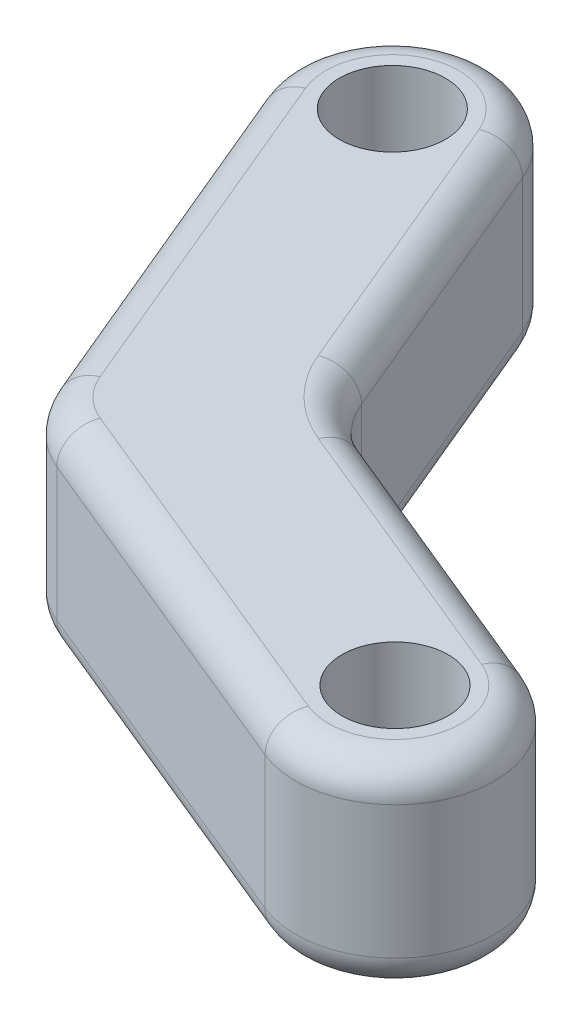
ISO-10303-21;
HEADER;
FILE_DESCRIPTION(('STEP AP214'),'2;1');
FILE_NAME('part.step','',(''),(''),'','','');
FILE_SCHEMA(('AUTOMOTIVE_DESIGN { 1 0 10303 214 1 1 1 1 }'));
ENDSEC;
DATA;
#1=APPLICATION_CONTEXT('core data for automotive mechanical design processes');
#2=APPLICATION_PROTOCOL_DEFINITION('international standard','automotive_design',2000,#1);
#3=PRODUCT_CONTEXT('',#1,'mechanical');
#4=PRODUCT('Part','Part','',(#3));
#5=PRODUCT_RELATED_PRODUCT_CATEGORY('part','',(#4));
#6=PRODUCT_DEFINITION_FORMATION('','',#4);
#7=PRODUCT_DEFINITION_CONTEXT('part definition',#1,'design');
#8=PRODUCT_DEFINITION('design','',#6,#7);
#9=PRODUCT_DEFINITION_SHAPE('','',#8);
#10=(LENGTH_UNIT() NAMED_UNIT(*) SI_UNIT(.MILLI.,.METRE.));
#11=(NAMED_UNIT(*) PLANE_ANGLE_UNIT() SI_UNIT($,.RADIAN.));
#12=(NAMED_UNIT(*) SI_UNIT($,.STERADIAN.) SOLID_ANGLE_UNIT());
#13=UNCERTAINTY_MEASURE_WITH_UNIT(LENGTH_MEASURE(1.E-05),#10,'distance_accuracy_value','');
#14=(GEOMETRIC_REPRESENTATION_CONTEXT(3) GLOBAL_UNCERTAINTY_ASSIGNED_CONTEXT((#13)) GLOBAL_UNIT_ASSIGNED_CONTEXT((#10,
#11,#12)) REPRESENTATION_CONTEXT('',''));
#15=CARTESIAN_POINT('',(0.,0.,0.));
#16=DIRECTION('',(0.,0.,1.));
#17=DIRECTION('',(1.,0.,0.));
#18=AXIS2_PLACEMENT_3D('',#15,#16,#17);
#19=CARTESIAN_POINT('',(-6.06663002826154,6.,-8.98122794492106));
#20=DIRECTION('',(0.,1.,0.));
#21=DIRECTION('',(0.,0.,1.));
#22=AXIS2_PLACEMENT_3D('',#19,#20,#21);
#23=PLANE('',#22);
#24=CARTESIAN_POINT('',(0.,6.,0.));
#25=DIRECTION('',(0.,1.,0.));
#26=DIRECTION('',(0.,0.,1.));
#27=AXIS2_PLACEMENT_3D('',#24,#25,#26);
#28=CIRCLE('',#27,2.);
#29=CARTESIAN_POINT('',(-0.760449922443386,6.,1.84978807311969));
#30=VERTEX_POINT('',#29);
#31=CARTESIAN_POINT('',(0.760449922443389,6.,-1.84978807311969));
#32=VERTEX_POINT('',#31);
#33=EDGE_CURVE('E61',#30,#32,#28,.T.);
#34=ORIENTED_EDGE('',*,*,#33,.T.);
#35=DIRECTION('',(-0.924894036559844,0.,-0.380224961221694));
#36=VECTOR('',#35,1.);
#37=CARTESIAN_POINT('',(-7.58752987314831,6.,-5.28165179868168));
#38=LINE('',#37,#36);
#39=CARTESIAN_POINT('',(-7.58752987314831,6.,-5.28165179868168));
#40=VERTEX_POINT('',#39);
#41=EDGE_CURVE('E169',#32,#40,#38,.T.);
#42=ORIENTED_EDGE('',*,*,#41,.T.);
#43=CARTESIAN_POINT('',(-6.06663002826154,6.,-8.98122794492106));
#44=DIRECTION('',(0.,1.,0.));
#45=DIRECTION('',(0.,0.,1.));
#46=AXIS2_PLACEMENT_3D('',#43,#44,#45);
#47=CIRCLE('',#46,4.);
#48=CARTESIAN_POINT('',(-9.75806400260841,6.,-7.44067115822422));
#49=VERTEX_POINT('',#48);
#50=EDGE_CURVE('E195',#40,#49,#47,.F.);
#51=ORIENTED_EDGE('',*,*,#50,.T.);
#52=DIRECTION('',(-0.385139196674212,0.,-0.922858493586716));
#53=VECTOR('',#52,1.);
#54=CARTESIAN_POINT('',(-13.2342830128266,6.,-15.7702783933484));
#55=LINE('',#54,#53);
#56=CARTESIAN_POINT('',(-13.2342830128266,6.,-15.7702783933484));
#57=VERTEX_POINT('',#56);
#58=EDGE_CURVE('E377',#49,#57,#55,.T.);
#59=ORIENTED_EDGE('',*,*,#58,.T.);
#60=CARTESIAN_POINT('',(-15.08,6.,-15.));
#61=DIRECTION('',(0.,1.,0.));
#62=DIRECTION('',(0.,0.,1.));
#63=AXIS2_PLACEMENT_3D('',#60,#61,#62);
#64=CIRCLE('',#63,2.);
#65=CARTESIAN_POINT('',(-16.9257169871734,6.,-14.2297216066516));
#66=VERTEX_POINT('',#65);
#67=EDGE_CURVE('E380',#57,#66,#64,.T.);
#68=ORIENTED_EDGE('',*,*,#67,.T.);
#69=DIRECTION('',(0.385139196674212,0.,0.922858493586716));
#70=VECTOR('',#69,1.);
#71=CARTESIAN_POINT('',(-12.4923187049717,6.,-3.60655134635845));
#72=LINE('',#71,#70);
#73=CARTESIAN_POINT('',(-12.4923187049717,6.,-3.60655134635844));
#74=VERTEX_POINT('',#73);
#75=EDGE_CURVE('E383',#66,#74,#72,.T.);
#76=ORIENTED_EDGE('',*,*,#75,.T.);
#77=CARTESIAN_POINT('',(-10.6466017177982,6.,-4.37682973970686));
#78=DIRECTION('',(0.,1.,0.));
#79=DIRECTION('',(0.,0.,1.));
#80=AXIS2_PLACEMENT_3D('',#77,#78,#79);
#81=CIRCLE('',#80,2.);
#82=CARTESIAN_POINT('',(-11.4070516402416,6.,-2.52704166658717));
#83=VERTEX_POINT('',#82);
#84=EDGE_CURVE('E386',#74,#83,#81,.T.);
#85=ORIENTED_EDGE('',*,*,#84,.T.);
#86=DIRECTION('',(0.924894036559844,0.,0.380224961221694));
#87=VECTOR('',#86,1.);
#88=CARTESIAN_POINT('',(-0.760449922443385,6.,1.84978807311969));
#89=LINE('',#88,#87);
#90=EDGE_CURVE('E66',#83,#30,#89,.T.);
#91=ORIENTED_EDGE('',*,*,#90,.T.);
#92=EDGE_LOOP('',(#34,#42,#51,#59,#68,#76,#85,#91));
#93=FACE_BOUND('',#92,.T.);
#94=CARTESIAN_POINT('',(-15.08,6.,-15.));
#95=DIRECTION('',(0.,1.,0.));
#96=DIRECTION('',(0.,0.,1.));
#97=AXIS2_PLACEMENT_3D('',#94,#95,#96);
#98=CIRCLE('',#97,1.6);
#99=CARTESIAN_POINT('',(-15.08,6.,-13.4));
#100=VERTEX_POINT('',#99);
#101=EDGE_CURVE('E183',#100,#100,#98,.T.);
#102=ORIENTED_EDGE('',*,*,#101,.F.);
#103=EDGE_LOOP('',(#102));
#104=FACE_BOUND('',#103,.T.);
#105=CARTESIAN_POINT('',(0.,6.,0.));
#106=DIRECTION('',(0.,1.,0.));
#107=DIRECTION('',(0.,0.,1.));
#108=AXIS2_PLACEMENT_3D('',#105,#106,#107);
#109=CIRCLE('',#108,1.6);
#110=CARTESIAN_POINT('',(0.,6.,1.6));
#111=VERTEX_POINT('',#110);
#112=EDGE_CURVE('E273',#111,#111,#109,.T.);
#113=ORIENTED_EDGE('',*,*,#112,.F.);
#114=EDGE_LOOP('',(#113));
#115=FACE_BOUND('',#114,.T.);
#116=ADVANCED_FACE('F43',(#93,#104,#115),#23,.T.);
#117=CARTESIAN_POINT('',(-6.06663002826154,0.,-8.98122794492106));
#118=DIRECTION('',(0.,1.,0.));
#119=DIRECTION('',(0.,0.,1.));
#120=AXIS2_PLACEMENT_3D('',#117,#118,#119);
#121=PLANE('',#120);
#122=CARTESIAN_POINT('',(-6.06663002826154,0.,-8.98122794492106));
#123=DIRECTION('',(0.,1.,0.));
#124=DIRECTION('',(0.,0.,1.));
#125=AXIS2_PLACEMENT_3D('',#122,#123,#124);
#126=CIRCLE('',#125,4.);
#127=CARTESIAN_POINT('',(-9.75806400260841,0.,-7.44067115822422));
#128=VERTEX_POINT('',#127);
#129=CARTESIAN_POINT('',(-7.58752987314831,0.,-5.28165179868168));
#130=VERTEX_POINT('',#129);
#131=EDGE_CURVE('E314',#128,#130,#126,.T.);
#132=ORIENTED_EDGE('',*,*,#131,.T.);
#133=DIRECTION('',(-0.924894036559844,0.,-0.380224961221694));
#134=VECTOR('',#133,1.);
#135=CARTESIAN_POINT('',(-7.58752987314832,0.,-5.28165179868169));
#136=LINE('',#135,#134);
#137=CARTESIAN_POINT('',(0.760449922443389,0.,-1.84978807311969));
#138=VERTEX_POINT('',#137);
#139=EDGE_CURVE('E335',#130,#138,#136,.F.);
#140=ORIENTED_EDGE('',*,*,#139,.T.);
#141=CARTESIAN_POINT('',(0.,0.,0.));
#142=DIRECTION('',(0.,1.,0.));
#143=DIRECTION('',(0.,0.,1.));
#144=AXIS2_PLACEMENT_3D('',#141,#142,#143);
#145=CIRCLE('',#144,2.);
#146=CARTESIAN_POINT('',(-0.760449922443386,0.,1.84978807311969));
#147=VERTEX_POINT('',#146);
#148=EDGE_CURVE('E332',#138,#147,#145,.F.);
#149=ORIENTED_EDGE('',*,*,#148,.T.);
#150=DIRECTION('',(0.924894036559844,0.,0.380224961221694));
#151=VECTOR('',#150,1.);
#152=CARTESIAN_POINT('',(-9.10842971803509,0.,-1.58207565244231));
#153=LINE('',#152,#151);
#154=CARTESIAN_POINT('',(-11.4070516402416,0.,-2.52704166658717));
#155=VERTEX_POINT('',#154);
#156=EDGE_CURVE('E329',#147,#155,#153,.F.);
#157=ORIENTED_EDGE('',*,*,#156,.T.);
#158=CARTESIAN_POINT('',(-10.6466017177982,0.,-4.37682973970686));
#159=DIRECTION('',(0.,1.,0.));
#160=DIRECTION('',(0.,0.,1.));
#161=AXIS2_PLACEMENT_3D('',#158,#159,#160);
#162=CIRCLE('',#161,2.);
#163=CARTESIAN_POINT('',(-12.4923187049717,0.,-3.60655134635844));
#164=VERTEX_POINT('',#163);
#165=EDGE_CURVE('E326',#155,#164,#162,.F.);
#166=ORIENTED_EDGE('',*,*,#165,.T.);
#167=DIRECTION('',(0.385139196674212,0.,0.922858493586716));
#168=VECTOR('',#167,1.);
#169=CARTESIAN_POINT('',(-13.4494979769553,0.,-5.90011437152737));
#170=LINE('',#169,#168);
#171=CARTESIAN_POINT('',(-16.9257169871734,0.,-14.2297216066516));
#172=VERTEX_POINT('',#171);
#173=EDGE_CURVE('E323',#164,#172,#170,.F.);
#174=ORIENTED_EDGE('',*,*,#173,.T.);
#175=CARTESIAN_POINT('',(-15.08,0.,-15.));
#176=DIRECTION('',(0.,1.,0.));
#177=DIRECTION('',(0.,0.,1.));
#178=AXIS2_PLACEMENT_3D('',#175,#176,#177);
#179=CIRCLE('',#178,2.);
#180=CARTESIAN_POINT('',(-13.2342830128266,0.,-15.7702783933484));
#181=VERTEX_POINT('',#180);
#182=EDGE_CURVE('E320',#172,#181,#179,.F.);
#183=ORIENTED_EDGE('',*,*,#182,.T.);
#184=DIRECTION('',(-0.385139196674212,0.,-0.922858493586716));
#185=VECTOR('',#184,1.);
#186=CARTESIAN_POINT('',(-9.75806400260841,0.,-7.44067115822421));
#187=LINE('',#186,#185);
#188=EDGE_CURVE('E317',#181,#128,#187,.F.);
#189=ORIENTED_EDGE('',*,*,#188,.T.);
#190=EDGE_LOOP('',(#132,#140,#149,#157,#166,#174,#183,#189));
#191=FACE_BOUND('',#190,.T.);
#192=CARTESIAN_POINT('',(-15.08,0.,-15.));
#193=DIRECTION('',(0.,1.,0.));
#194=DIRECTION('',(0.,0.,1.));
#195=AXIS2_PLACEMENT_3D('',#192,#193,#194);
#196=CIRCLE('',#195,1.6);
#197=CARTESIAN_POINT('',(-15.08,0.,-13.4));
#198=VERTEX_POINT('',#197);
#199=EDGE_CURVE('E279',#198,#198,#196,.T.);
#200=ORIENTED_EDGE('',*,*,#199,.T.);
#201=EDGE_LOOP('',(#200));
#202=FACE_BOUND('',#201,.T.);
#203=CARTESIAN_POINT('',(0.,0.,0.));
#204=DIRECTION('',(0.,1.,0.));
#205=DIRECTION('',(0.,0.,1.));
#206=AXIS2_PLACEMENT_3D('',#203,#204,#205);
#207=CIRCLE('',#206,1.6);
#208=CARTESIAN_POINT('',(0.,0.,1.6));
#209=VERTEX_POINT('',#208);
#210=EDGE_CURVE('E266',#209,#209,#207,.T.);
#211=ORIENTED_EDGE('',*,*,#210,.T.);
#212=EDGE_LOOP('',(#211));
#213=FACE_BOUND('',#212,.T.);
#214=ADVANCED_FACE('F440',(#191,#202,#213),#121,.F.);
#215=CARTESIAN_POINT('',(-6.06663002826154,6.,-8.98122794492106));
#216=DIRECTION('',(0.,-1.,0.));
#217=DIRECTION('',(0.,0.,-1.));
#218=AXIS2_PLACEMENT_3D('',#215,#216,#217);
#219=CYLINDRICAL_SURFACE('',#218,3.);
#220=DIRECTION('',(0.,-1.,0.));
#221=VECTOR('',#220,1.);
#222=CARTESIAN_POINT('',(-7.20730491192661,6.,-6.20654583524153));
#223=LINE('',#222,#221);
#224=CARTESIAN_POINT('',(-7.20730491192661,5.,-6.20654583524153));
#225=VERTEX_POINT('',#224);
#226=CARTESIAN_POINT('',(-7.20730491192661,1.,-6.20654583524153));
#227=VERTEX_POINT('',#226);
#228=EDGE_CURVE('E161',#225,#227,#223,.T.);
#229=ORIENTED_EDGE('',*,*,#228,.T.);
#230=CARTESIAN_POINT('',(-6.06663002826154,1.,-8.98122794492106));
#231=DIRECTION('',(0.,1.,0.));
#232=DIRECTION('',(0.,0.,1.));
#233=AXIS2_PLACEMENT_3D('',#230,#231,#232);
#234=CIRCLE('',#233,3.);
#235=CARTESIAN_POINT('',(-8.83520550902169,1.,-7.82581035489844));
#236=VERTEX_POINT('',#235);
#237=EDGE_CURVE('E11',#227,#236,#234,.F.);
#238=ORIENTED_EDGE('',*,*,#237,.T.);
#239=DIRECTION('',(0.,-1.,0.));
#240=VECTOR('',#239,1.);
#241=CARTESIAN_POINT('',(-8.83520550902169,6.,-7.82581035489844));
#242=LINE('',#241,#240);
#243=CARTESIAN_POINT('',(-8.83520550902169,5.,-7.82581035489844));
#244=VERTEX_POINT('',#243);
#245=EDGE_CURVE('E163',#244,#236,#242,.T.);
#246=ORIENTED_EDGE('',*,*,#245,.F.);
#247=CARTESIAN_POINT('',(-6.06663002826154,5.,-8.98122794492106));
#248=DIRECTION('',(0.,1.,0.));
#249=DIRECTION('',(0.,0.,1.));
#250=AXIS2_PLACEMENT_3D('',#247,#248,#249);
#251=CIRCLE('',#250,3.);
#252=EDGE_CURVE('E53',#244,#225,#251,.T.);
#253=ORIENTED_EDGE('',*,*,#252,.T.);
#254=EDGE_LOOP('',(#229,#238,#246,#253));
#255=FACE_BOUND('',#254,.T.);
#256=ADVANCED_FACE('F160',(#255),#219,.F.);
#257=CARTESIAN_POINT('',(-12.3114245192399,6.,-16.1554175900226));
#258=DIRECTION('',(-0.922858493586716,0.,0.385139196674212));
#259=DIRECTION('',(0.385139196674212,0.,0.922858493586716));
#260=AXIS2_PLACEMENT_3D('',#257,#258,#259);
#261=PLANE('',#260);
#262=ORIENTED_EDGE('',*,*,#245,.T.);
#263=DIRECTION('',(-0.385139196674212,0.,-0.922858493586716));
#264=VECTOR('',#263,1.);
#265=CARTESIAN_POINT('',(-12.3114245192399,1.,-16.1554175900226));
#266=LINE('',#265,#264);
#267=CARTESIAN_POINT('',(-12.3114245192399,1.,-16.1554175900226));
#268=VERTEX_POINT('',#267);
#269=EDGE_CURVE('E372',#236,#268,#266,.T.);
#270=ORIENTED_EDGE('',*,*,#269,.T.);
#271=DIRECTION('',(0.,-1.,0.));
#272=VECTOR('',#271,1.);
#273=CARTESIAN_POINT('',(-12.3114245192399,6.,-16.1554175900226));
#274=LINE('',#273,#272);
#275=CARTESIAN_POINT('',(-12.3114245192399,5.,-16.1554175900226));
#276=VERTEX_POINT('',#275);
#277=EDGE_CURVE('E306',#276,#268,#274,.T.);
#278=ORIENTED_EDGE('',*,*,#277,.F.);
#279=DIRECTION('',(-0.385139196674212,0.,-0.922858493586716));
#280=VECTOR('',#279,1.);
#281=CARTESIAN_POINT('',(-8.83520550902169,5.,-7.82581035489844));
#282=LINE('',#281,#280);
#283=EDGE_CURVE('E369',#276,#244,#282,.F.);
#284=ORIENTED_EDGE('',*,*,#283,.T.);
#285=EDGE_LOOP('',(#262,#270,#278,#284));
#286=FACE_BOUND('',#285,.T.);
#287=ADVANCED_FACE('F468',(#286),#261,.F.);
#288=CARTESIAN_POINT('',(-15.08,6.,-15.));
#289=DIRECTION('',(0.,-1.,0.));
#290=DIRECTION('',(0.,0.,-1.));
#291=AXIS2_PLACEMENT_3D('',#288,#289,#290);
#292=CYLINDRICAL_SURFACE('',#291,3.);
#293=ORIENTED_EDGE('',*,*,#277,.T.);
#294=CARTESIAN_POINT('',(-15.08,1.,-15.));
#295=DIRECTION('',(0.,1.,0.));
#296=DIRECTION('',(0.,0.,1.));
#297=AXIS2_PLACEMENT_3D('',#294,#295,#296);
#298=CIRCLE('',#297,3.);
#299=CARTESIAN_POINT('',(-17.8485754807602,1.,-13.8445824099774));
#300=VERTEX_POINT('',#299);
#301=EDGE_CURVE('E366',#268,#300,#298,.T.);
#302=ORIENTED_EDGE('',*,*,#301,.T.);
#303=DIRECTION('',(0.,-1.,0.));
#304=VECTOR('',#303,1.);
#305=CARTESIAN_POINT('',(-17.8485754807602,6.,-13.8445824099774));
#306=LINE('',#305,#304);
#307=CARTESIAN_POINT('',(-17.8485754807602,5.,-13.8445824099774));
#308=VERTEX_POINT('',#307);
#309=EDGE_CURVE('E302',#308,#300,#306,.T.);
#310=ORIENTED_EDGE('',*,*,#309,.F.);
#311=CARTESIAN_POINT('',(-15.08,5.,-15.));
#312=DIRECTION('',(0.,1.,0.));
#313=DIRECTION('',(0.,0.,1.));
#314=AXIS2_PLACEMENT_3D('',#311,#312,#313);
#315=CIRCLE('',#314,3.);
#316=EDGE_CURVE('E363',#308,#276,#315,.F.);
#317=ORIENTED_EDGE('',*,*,#316,.T.);
#318=EDGE_LOOP('',(#293,#302,#310,#317));
#319=FACE_BOUND('',#318,.T.);
#320=ADVANCED_FACE('F464',(#319),#292,.T.);
#321=CARTESIAN_POINT('',(-17.8485754807602,6.,-13.8445824099774));
#322=DIRECTION('',(0.922858493586716,0.,-0.385139196674212));
#323=DIRECTION('',(-0.385139196674212,0.,-0.922858493586716));
#324=AXIS2_PLACEMENT_3D('',#321,#322,#323);
#325=PLANE('',#324);
#326=ORIENTED_EDGE('',*,*,#309,.T.);
#327=DIRECTION('',(0.385139196674212,0.,0.922858493586716));
#328=VECTOR('',#327,1.);
#329=CARTESIAN_POINT('',(-17.8485754807602,1.,-13.8445824099774));
#330=LINE('',#329,#328);
#331=CARTESIAN_POINT('',(-13.4151771985584,1.,-3.22141214968424));
#332=VERTEX_POINT('',#331);
#333=EDGE_CURVE('E360',#300,#332,#330,.T.);
#334=ORIENTED_EDGE('',*,*,#333,.T.);
#335=DIRECTION('',(0.,-1.,0.));
#336=VECTOR('',#335,1.);
#337=CARTESIAN_POINT('',(-13.4151771985584,6.,-3.22141214968424));
#338=LINE('',#337,#336);
#339=CARTESIAN_POINT('',(-13.4151771985584,5.,-3.22141214968424));
#340=VERTEX_POINT('',#339);
#341=EDGE_CURVE('E298',#340,#332,#338,.T.);
#342=ORIENTED_EDGE('',*,*,#341,.F.);
#343=DIRECTION('',(0.385139196674212,0.,0.922858493586716));
#344=VECTOR('',#343,1.);
#345=CARTESIAN_POINT('',(-17.8485754807602,5.,-13.8445824099774));
#346=LINE('',#345,#344);
#347=EDGE_CURVE('E357',#340,#308,#346,.F.);
#348=ORIENTED_EDGE('',*,*,#347,.T.);
#349=EDGE_LOOP('',(#326,#334,#342,#348));
#350=FACE_BOUND('',#349,.T.);
#351=ADVANCED_FACE('F460',(#350),#325,.F.);
#352=CARTESIAN_POINT('',(-10.6466017177982,6.,-4.37682973970686));
#353=DIRECTION('',(0.,-1.,0.));
#354=DIRECTION('',(0.,0.,-1.));
#355=AXIS2_PLACEMENT_3D('',#352,#353,#354);
#356=CYLINDRICAL_SURFACE('',#355,3.);
#357=ORIENTED_EDGE('',*,*,#341,.T.);
#358=CARTESIAN_POINT('',(-10.6466017177982,1.,-4.37682973970686));
#359=DIRECTION('',(0.,1.,0.));
#360=DIRECTION('',(0.,0.,1.));
#361=AXIS2_PLACEMENT_3D('',#358,#359,#360);
#362=CIRCLE('',#361,3.);
#363=CARTESIAN_POINT('',(-11.7872766014633,1.,-1.60214763002732));
#364=VERTEX_POINT('',#363);
#365=EDGE_CURVE('E354',#332,#364,#362,.T.);
#366=ORIENTED_EDGE('',*,*,#365,.T.);
#367=DIRECTION('',(0.,-1.,0.));
#368=VECTOR('',#367,1.);
#369=CARTESIAN_POINT('',(-11.7872766014633,6.,-1.60214763002732));
#370=LINE('',#369,#368);
#371=CARTESIAN_POINT('',(-11.7872766014633,5.,-1.60214763002732));
#372=VERTEX_POINT('',#371);
#373=EDGE_CURVE('E294',#372,#364,#370,.T.);
#374=ORIENTED_EDGE('',*,*,#373,.F.);
#375=CARTESIAN_POINT('',(-10.6466017177982,5.,-4.37682973970686));
#376=DIRECTION('',(0.,1.,0.));
#377=DIRECTION('',(0.,0.,1.));
#378=AXIS2_PLACEMENT_3D('',#375,#376,#377);
#379=CIRCLE('',#378,3.);
#380=EDGE_CURVE('E351',#372,#340,#379,.F.);
#381=ORIENTED_EDGE('',*,*,#380,.T.);
#382=EDGE_LOOP('',(#357,#366,#374,#381));
#383=FACE_BOUND('',#382,.T.);
#384=ADVANCED_FACE('F457',(#383),#356,.T.);
#385=CARTESIAN_POINT('',(-11.7872766014633,6.,-1.60214763002732));
#386=DIRECTION('',(0.380224961221694,0.,-0.924894036559844));
#387=DIRECTION('',(-0.924894036559844,0.,-0.380224961221694));
#388=AXIS2_PLACEMENT_3D('',#385,#386,#387);
#389=PLANE('',#388);
#390=ORIENTED_EDGE('',*,*,#373,.T.);
#391=DIRECTION('',(0.924894036559844,0.,0.380224961221694));
#392=VECTOR('',#391,1.);
#393=CARTESIAN_POINT('',(-11.7872766014633,1.,-1.60214763002732));
#394=LINE('',#393,#392);
#395=CARTESIAN_POINT('',(-1.14067488366508,1.,2.77468210967953));
#396=VERTEX_POINT('',#395);
#397=EDGE_CURVE('E348',#364,#396,#394,.T.);
#398=ORIENTED_EDGE('',*,*,#397,.T.);
#399=DIRECTION('',(0.,-1.,0.));
#400=VECTOR('',#399,1.);
#401=CARTESIAN_POINT('',(-1.14067488366508,6.,2.77468210967953));
#402=LINE('',#401,#400);
#403=CARTESIAN_POINT('',(-1.14067488366508,5.,2.77468210967953));
#404=VERTEX_POINT('',#403);
#405=EDGE_CURVE('E290',#404,#396,#402,.T.);
#406=ORIENTED_EDGE('',*,*,#405,.F.);
#407=DIRECTION('',(0.924894036559844,0.,0.380224961221694));
#408=VECTOR('',#407,1.);
#409=CARTESIAN_POINT('',(-11.7872766014633,5.,-1.60214763002732));
#410=LINE('',#409,#408);
#411=EDGE_CURVE('E345',#404,#372,#410,.F.);
#412=ORIENTED_EDGE('',*,*,#411,.T.);
#413=EDGE_LOOP('',(#390,#398,#406,#412));
#414=FACE_BOUND('',#413,.T.);
#415=ADVANCED_FACE('F416',(#414),#389,.F.);
#416=CARTESIAN_POINT('',(0.,6.,0.));
#417=DIRECTION('',(0.,-1.,0.));
#418=DIRECTION('',(0.,0.,-1.));
#419=AXIS2_PLACEMENT_3D('',#416,#417,#418);
#420=CYLINDRICAL_SURFACE('',#419,3.);
#421=ORIENTED_EDGE('',*,*,#405,.T.);
#422=CARTESIAN_POINT('',(0.,1.,0.));
#423=DIRECTION('',(0.,1.,0.));
#424=DIRECTION('',(0.,0.,1.));
#425=AXIS2_PLACEMENT_3D('',#422,#423,#424);
#426=CIRCLE('',#425,3.);
#427=CARTESIAN_POINT('',(1.14067488366508,1.,-2.77468210967953));
#428=VERTEX_POINT('',#427);
#429=EDGE_CURVE('E342',#396,#428,#426,.T.);
#430=ORIENTED_EDGE('',*,*,#429,.T.);
#431=DIRECTION('',(0.,-1.,0.));
#432=VECTOR('',#431,1.);
#433=CARTESIAN_POINT('',(1.14067488366508,6.,-2.77468210967953));
#434=LINE('',#433,#432);
#435=CARTESIAN_POINT('',(1.14067488366508,5.,-2.77468210967953));
#436=VERTEX_POINT('',#435);
#437=EDGE_CURVE('E182',#436,#428,#434,.T.);
#438=ORIENTED_EDGE('',*,*,#437,.F.);
#439=CARTESIAN_POINT('',(0.,5.,0.));
#440=DIRECTION('',(0.,1.,0.));
#441=DIRECTION('',(0.,0.,1.));
#442=AXIS2_PLACEMENT_3D('',#439,#440,#441);
#443=CIRCLE('',#442,3.);
#444=EDGE_CURVE('E339',#436,#404,#443,.F.);
#445=ORIENTED_EDGE('',*,*,#444,.T.);
#446=EDGE_LOOP('',(#421,#430,#438,#445));
#447=FACE_BOUND('',#446,.T.);
#448=ADVANCED_FACE('F413',(#447),#420,.T.);
#449=CARTESIAN_POINT('',(-7.20730491192661,6.,-6.20654583524153));
#450=DIRECTION('',(-0.380224961221694,0.,0.924894036559844));
#451=DIRECTION('',(0.924894036559844,0.,0.380224961221694));
#452=AXIS2_PLACEMENT_3D('',#449,#450,#451);
#453=PLANE('',#452);
#454=ORIENTED_EDGE('',*,*,#437,.T.);
#455=DIRECTION('',(-0.924894036559844,0.,-0.380224961221694));
#456=VECTOR('',#455,1.);
#457=CARTESIAN_POINT('',(-7.20730491192661,1.,-6.20654583524153));
#458=LINE('',#457,#456);
#459=EDGE_CURVE('E180',#428,#227,#458,.T.);
#460=ORIENTED_EDGE('',*,*,#459,.T.);
#461=ORIENTED_EDGE('',*,*,#228,.F.);
#462=DIRECTION('',(-0.924894036559844,0.,-0.380224961221694));
#463=VECTOR('',#462,1.);
#464=CARTESIAN_POINT('',(1.14067488366508,5.,-2.77468210967953));
#465=LINE('',#464,#463);
#466=EDGE_CURVE('E177',#225,#436,#465,.F.);
#467=ORIENTED_EDGE('',*,*,#466,.T.);
#468=EDGE_LOOP('',(#454,#460,#461,#467));
#469=FACE_BOUND('',#468,.T.);
#470=ADVANCED_FACE('F176',(#469),#453,.F.);
#471=CARTESIAN_POINT('',(-15.08,6.,-15.));
#472=DIRECTION('',(0.,-1.,0.));
#473=DIRECTION('',(0.,0.,-1.));
#474=AXIS2_PLACEMENT_3D('',#471,#472,#473);
#475=CYLINDRICAL_SURFACE('',#474,1.6);
#476=ORIENTED_EDGE('',*,*,#101,.T.);
#477=EDGE_LOOP('',(#476));
#478=FACE_BOUND('',#477,.T.);
#479=ORIENTED_EDGE('',*,*,#199,.F.);
#480=EDGE_LOOP('',(#479));
#481=FACE_BOUND('',#480,.T.);
#482=ADVANCED_FACE('F448',(#478,#481),#475,.F.);
#483=CARTESIAN_POINT('',(0.,6.,0.));
#484=DIRECTION('',(0.,-1.,0.));
#485=DIRECTION('',(0.,0.,-1.));
#486=AXIS2_PLACEMENT_3D('',#483,#484,#485);
#487=CYLINDRICAL_SURFACE('',#486,1.6);
#488=ORIENTED_EDGE('',*,*,#112,.T.);
#489=EDGE_LOOP('',(#488));
#490=FACE_BOUND('',#489,.T.);
#491=ORIENTED_EDGE('',*,*,#210,.F.);
#492=EDGE_LOOP('',(#491));
#493=FACE_BOUND('',#492,.T.);
#494=ADVANCED_FACE('F512',(#490,#493),#487,.F.);
#495=CARTESIAN_POINT('',(-16.9257169871734,1.,-14.2297216066516));
#496=DIRECTION('',(0.385139196674212,0.,0.922858493586716));
#497=DIRECTION('',(0.922858493586716,0.,-0.385139196674212));
#498=AXIS2_PLACEMENT_3D('',#495,#496,#497);
#499=CYLINDRICAL_SURFACE('',#498,1.);
#500=CARTESIAN_POINT('',(-16.9257169871734,1.,-14.2297216066516));
#501=DIRECTION('',(-0.385139196674212,0.,-0.922858493586716));
#502=DIRECTION('',(-0.922858493586716,0.,0.385139196674212));
#503=AXIS2_PLACEMENT_3D('',#500,#501,#502);
#504=CIRCLE('',#503,1.);
#505=EDGE_CURVE('E257',#172,#300,#504,.T.);
#506=ORIENTED_EDGE('',*,*,#505,.F.);
#507=ORIENTED_EDGE('',*,*,#173,.F.);
#508=CARTESIAN_POINT('',(-12.4923187049717,1.,-3.60655134635845));
#509=DIRECTION('',(0.385139196674212,0.,0.922858493586716));
#510=DIRECTION('',(0.922858493586716,0.,-0.385139196674212));
#511=AXIS2_PLACEMENT_3D('',#508,#509,#510);
#512=CIRCLE('',#511,1.);
#513=EDGE_CURVE('E202',#332,#164,#512,.T.);
#514=ORIENTED_EDGE('',*,*,#513,.F.);
#515=ORIENTED_EDGE('',*,*,#333,.F.);
#516=EDGE_LOOP('',(#506,#507,#514,#515));
#517=FACE_BOUND('',#516,.T.);
#518=ADVANCED_FACE('F519',(#517),#499,.T.);
#519=CARTESIAN_POINT('',(-10.6466017177982,1.,-4.37682973970686));
#520=DIRECTION('',(0.,1.,0.));
#521=DIRECTION('',(0.,0.,1.));
#522=AXIS2_PLACEMENT_3D('',#519,#520,#521);
#523=TOROIDAL_SURFACE('',#522,2.,1.);
#524=ORIENTED_EDGE('',*,*,#513,.T.);
#525=ORIENTED_EDGE('',*,*,#165,.F.);
#526=CARTESIAN_POINT('',(-11.4070516402416,1.,-2.52704166658717));
#527=DIRECTION('',(0.924894036559845,0.,0.380224961221691));
#528=DIRECTION('',(0.380224961221691,0.,-0.924894036559845));
#529=AXIS2_PLACEMENT_3D('',#526,#527,#528);
#530=CIRCLE('',#529,1.);
#531=EDGE_CURVE('E254',#364,#155,#530,.T.);
#532=ORIENTED_EDGE('',*,*,#531,.F.);
#533=ORIENTED_EDGE('',*,*,#365,.F.);
#534=EDGE_LOOP('',(#524,#525,#532,#533));
#535=FACE_BOUND('',#534,.T.);
#536=ADVANCED_FACE('F525',(#535),#523,.T.);
#537=CARTESIAN_POINT('',(-15.08,1.,-15.));
#538=DIRECTION('',(0.,1.,0.));
#539=DIRECTION('',(0.,0.,1.));
#540=AXIS2_PLACEMENT_3D('',#537,#538,#539);
#541=TOROIDAL_SURFACE('',#540,2.,1.);
#542=ORIENTED_EDGE('',*,*,#505,.T.);
#543=ORIENTED_EDGE('',*,*,#301,.F.);
#544=CARTESIAN_POINT('',(-13.2342830128266,1.,-15.7702783933484));
#545=DIRECTION('',(0.385139196674211,0.,0.922858493586716));
#546=DIRECTION('',(0.922858493586717,0.,-0.385139196674211));
#547=AXIS2_PLACEMENT_3D('',#544,#545,#546);
#548=CIRCLE('',#547,1.);
#549=EDGE_CURVE('E250',#181,#268,#548,.T.);
#550=ORIENTED_EDGE('',*,*,#549,.F.);
#551=ORIENTED_EDGE('',*,*,#182,.F.);
#552=EDGE_LOOP('',(#542,#543,#550,#551));
#553=FACE_BOUND('',#552,.T.);
#554=ADVANCED_FACE('F533',(#553),#541,.T.);
#555=CARTESIAN_POINT('',(-11.4070516402416,1.,-2.52704166658717));
#556=DIRECTION('',(0.924894036559844,0.,0.380224961221694));
#557=DIRECTION('',(0.380224961221694,0.,-0.924894036559844));
#558=AXIS2_PLACEMENT_3D('',#555,#556,#557);
#559=CYLINDRICAL_SURFACE('',#558,1.);
#560=ORIENTED_EDGE('',*,*,#531,.T.);
#561=ORIENTED_EDGE('',*,*,#156,.F.);
#562=CARTESIAN_POINT('',(-0.760449922443386,1.,1.84978807311969));
#563=DIRECTION('',(0.924894036559844,0.,0.380224961221694));
#564=DIRECTION('',(0.380224961221694,0.,-0.924894036559844));
#565=AXIS2_PLACEMENT_3D('',#562,#563,#564);
#566=CIRCLE('',#565,1.);
#567=EDGE_CURVE('E246',#396,#147,#566,.T.);
#568=ORIENTED_EDGE('',*,*,#567,.F.);
#569=ORIENTED_EDGE('',*,*,#397,.F.);
#570=EDGE_LOOP('',(#560,#561,#568,#569));
#571=FACE_BOUND('',#570,.T.);
#572=ADVANCED_FACE('F421',(#571),#559,.T.);
#573=CARTESIAN_POINT('',(-13.2342830128266,1.,-15.7702783933484));
#574=DIRECTION('',(-0.385139196674212,0.,-0.922858493586716));
#575=DIRECTION('',(-0.922858493586716,0.,0.385139196674212));
#576=AXIS2_PLACEMENT_3D('',#573,#574,#575);
#577=CYLINDRICAL_SURFACE('',#576,1.);
#578=ORIENTED_EDGE('',*,*,#549,.T.);
#579=ORIENTED_EDGE('',*,*,#269,.F.);
#580=CARTESIAN_POINT('',(-9.75806400260841,1.,-7.44067115822422));
#581=DIRECTION('',(0.385139196674212,0.,0.922858493586716));
#582=DIRECTION('',(0.922858493586716,0.,-0.385139196674212));
#583=AXIS2_PLACEMENT_3D('',#580,#581,#582);
#584=CIRCLE('',#583,1.);
#585=EDGE_CURVE('E240',#128,#236,#584,.T.);
#586=ORIENTED_EDGE('',*,*,#585,.F.);
#587=ORIENTED_EDGE('',*,*,#188,.F.);
#588=EDGE_LOOP('',(#578,#579,#586,#587));
#589=FACE_BOUND('',#588,.T.);
#590=ADVANCED_FACE('F546',(#589),#577,.T.);
#591=CARTESIAN_POINT('',(0.,1.,0.));
#592=DIRECTION('',(0.,1.,0.));
#593=DIRECTION('',(0.,0.,1.));
#594=AXIS2_PLACEMENT_3D('',#591,#592,#593);
#595=TOROIDAL_SURFACE('',#594,2.,1.);
#596=ORIENTED_EDGE('',*,*,#567,.T.);
#597=ORIENTED_EDGE('',*,*,#148,.F.);
#598=CARTESIAN_POINT('',(0.760449922443389,1.,-1.84978807311969));
#599=DIRECTION('',(-0.924894036559844,0.,-0.380224961221694));
#600=DIRECTION('',(-0.380224961221694,0.,0.924894036559844));
#601=AXIS2_PLACEMENT_3D('',#598,#599,#600);
#602=CIRCLE('',#601,1.);
#603=EDGE_CURVE('E233',#428,#138,#602,.T.);
#604=ORIENTED_EDGE('',*,*,#603,.F.);
#605=ORIENTED_EDGE('',*,*,#429,.F.);
#606=EDGE_LOOP('',(#596,#597,#604,#605));
#607=FACE_BOUND('',#606,.T.);
#608=ADVANCED_FACE('F427',(#607),#595,.T.);
#609=CARTESIAN_POINT('',(-6.06663002826154,1.,-8.98122794492106));
#610=DIRECTION('',(0.,1.,0.));
#611=DIRECTION('',(0.,0.,1.));
#612=AXIS2_PLACEMENT_3D('',#609,#610,#611);
#613=TOROIDAL_SURFACE('',#612,4.,1.);
#614=ORIENTED_EDGE('',*,*,#585,.T.);
#615=ORIENTED_EDGE('',*,*,#237,.F.);
#616=CARTESIAN_POINT('',(-7.58752987314831,1.,-5.28165179868168));
#617=DIRECTION('',(0.924894036559843,0.,0.380224961221695));
#618=DIRECTION('',(0.380224961221695,0.,-0.924894036559843));
#619=AXIS2_PLACEMENT_3D('',#616,#617,#618);
#620=CIRCLE('',#619,1.);
#621=EDGE_CURVE('E227',#130,#227,#620,.T.);
#622=ORIENTED_EDGE('',*,*,#621,.F.);
#623=ORIENTED_EDGE('',*,*,#131,.F.);
#624=EDGE_LOOP('',(#614,#615,#622,#623));
#625=FACE_BOUND('',#624,.T.);
#626=ADVANCED_FACE('F430',(#625),#613,.T.);
#627=CARTESIAN_POINT('',(-7.58752987314831,1.,-5.28165179868168));
#628=DIRECTION('',(-0.924894036559844,0.,-0.380224961221694));
#629=DIRECTION('',(-0.380224961221694,0.,0.924894036559844));
#630=AXIS2_PLACEMENT_3D('',#627,#628,#629);
#631=CYLINDRICAL_SURFACE('',#630,1.);
#632=ORIENTED_EDGE('',*,*,#603,.T.);
#633=ORIENTED_EDGE('',*,*,#139,.F.);
#634=ORIENTED_EDGE('',*,*,#621,.T.);
#635=ORIENTED_EDGE('',*,*,#459,.F.);
#636=EDGE_LOOP('',(#632,#633,#634,#635));
#637=FACE_BOUND('',#636,.T.);
#638=ADVANCED_FACE('F428',(#637),#631,.T.);
#639=CARTESIAN_POINT('',(-13.4494979769553,5.,-5.90011437152737));
#640=DIRECTION('',(-0.385139196674212,0.,-0.922858493586716));
#641=DIRECTION('',(-0.922858493586716,0.,0.385139196674212));
#642=AXIS2_PLACEMENT_3D('',#639,#640,#641);
#643=CYLINDRICAL_SURFACE('',#642,1.);
#644=CARTESIAN_POINT('',(-16.9257169871734,5.,-14.2297216066516));
#645=DIRECTION('',(-0.385139196674212,0.,-0.922858493586716));
#646=DIRECTION('',(-0.922858493586716,0.,0.385139196674212));
#647=AXIS2_PLACEMENT_3D('',#644,#645,#646);
#648=CIRCLE('',#647,1.);
#649=EDGE_CURVE('E218',#308,#66,#648,.T.);
#650=ORIENTED_EDGE('',*,*,#649,.F.);
#651=ORIENTED_EDGE('',*,*,#347,.F.);
#652=CARTESIAN_POINT('',(-12.4923187049717,5.,-3.60655134635844));
#653=DIRECTION('',(0.385139196674208,0.,0.922858493586718));
#654=DIRECTION('',(0.922858493586718,0.,-0.385139196674208));
#655=AXIS2_PLACEMENT_3D('',#652,#653,#654);
#656=CIRCLE('',#655,1.);
#657=EDGE_CURVE('E47',#74,#340,#656,.T.);
#658=ORIENTED_EDGE('',*,*,#657,.F.);
#659=ORIENTED_EDGE('',*,*,#75,.F.);
#660=EDGE_LOOP('',(#650,#651,#658,#659));
#661=FACE_BOUND('',#660,.T.);
#662=ADVANCED_FACE('F45',(#661),#643,.T.);
#663=CARTESIAN_POINT('',(-10.6466017177982,5.,-4.37682973970686));
#664=DIRECTION('',(0.,1.,0.));
#665=DIRECTION('',(0.,0.,1.));
#666=AXIS2_PLACEMENT_3D('',#663,#664,#665);
#667=TOROIDAL_SURFACE('',#666,2.,1.);
#668=ORIENTED_EDGE('',*,*,#657,.T.);
#669=ORIENTED_EDGE('',*,*,#380,.F.);
#670=CARTESIAN_POINT('',(-11.4070516402416,5.,-2.52704166658717));
#671=DIRECTION('',(0.924894036559843,0.,0.380224961221694));
#672=DIRECTION('',(0.380224961221694,0.,-0.924894036559843));
#673=AXIS2_PLACEMENT_3D('',#670,#671,#672);
#674=CIRCLE('',#673,1.);
#675=EDGE_CURVE('E215',#83,#372,#674,.T.);
#676=ORIENTED_EDGE('',*,*,#675,.F.);
#677=ORIENTED_EDGE('',*,*,#84,.F.);
#678=EDGE_LOOP('',(#668,#669,#676,#677));
#679=FACE_BOUND('',#678,.T.);
#680=ADVANCED_FACE('F405',(#679),#667,.T.);
#681=CARTESIAN_POINT('',(-15.08,5.,-15.));
#682=DIRECTION('',(0.,1.,0.));
#683=DIRECTION('',(0.,0.,1.));
#684=AXIS2_PLACEMENT_3D('',#681,#682,#683);
#685=TOROIDAL_SURFACE('',#684,2.,1.);
#686=ORIENTED_EDGE('',*,*,#649,.T.);
#687=ORIENTED_EDGE('',*,*,#67,.F.);
#688=CARTESIAN_POINT('',(-13.2342830128266,5.,-15.7702783933484));
#689=DIRECTION('',(0.385139196674211,0.,0.922858493586716));
#690=DIRECTION('',(0.922858493586717,0.,-0.385139196674211));
#691=AXIS2_PLACEMENT_3D('',#688,#689,#690);
#692=CIRCLE('',#691,1.);
#693=EDGE_CURVE('E211',#276,#57,#692,.T.);
#694=ORIENTED_EDGE('',*,*,#693,.F.);
#695=ORIENTED_EDGE('',*,*,#316,.F.);
#696=EDGE_LOOP('',(#686,#687,#694,#695));
#697=FACE_BOUND('',#696,.T.);
#698=ADVANCED_FACE('F400',(#697),#685,.T.);
#699=CARTESIAN_POINT('',(-9.10842971803509,5.,-1.58207565244231));
#700=DIRECTION('',(-0.924894036559844,0.,-0.380224961221694));
#701=DIRECTION('',(-0.380224961221694,0.,0.924894036559844));
#702=AXIS2_PLACEMENT_3D('',#699,#700,#701);
#703=CYLINDRICAL_SURFACE('',#702,1.);
#704=ORIENTED_EDGE('',*,*,#675,.T.);
#705=ORIENTED_EDGE('',*,*,#411,.F.);
#706=CARTESIAN_POINT('',(-0.760449922443386,5.,1.84978807311969));
#707=DIRECTION('',(0.924894036559844,0.,0.380224961221694));
#708=DIRECTION('',(0.380224961221694,0.,-0.924894036559844));
#709=AXIS2_PLACEMENT_3D('',#706,#707,#708);
#710=CIRCLE('',#709,1.);
#711=EDGE_CURVE('E207',#30,#404,#710,.T.);
#712=ORIENTED_EDGE('',*,*,#711,.F.);
#713=ORIENTED_EDGE('',*,*,#90,.F.);
#714=EDGE_LOOP('',(#704,#705,#712,#713));
#715=FACE_BOUND('',#714,.T.);
#716=ADVANCED_FACE('F408',(#715),#703,.T.);
#717=CARTESIAN_POINT('',(-9.75806400260841,5.,-7.44067115822421));
#718=DIRECTION('',(0.385139196674212,0.,0.922858493586716));
#719=DIRECTION('',(0.922858493586716,0.,-0.385139196674212));
#720=AXIS2_PLACEMENT_3D('',#717,#718,#719);
#721=CYLINDRICAL_SURFACE('',#720,1.);
#722=ORIENTED_EDGE('',*,*,#693,.T.);
#723=ORIENTED_EDGE('',*,*,#58,.F.);
#724=CARTESIAN_POINT('',(-9.75806400260841,5.,-7.44067115822423));
#725=DIRECTION('',(0.385139196674212,0.,0.922858493586716));
#726=DIRECTION('',(0.922858493586716,0.,-0.385139196674212));
#727=AXIS2_PLACEMENT_3D('',#724,#725,#726);
#728=CIRCLE('',#727,1.);
#729=EDGE_CURVE('E199',#244,#49,#728,.T.);
#730=ORIENTED_EDGE('',*,*,#729,.F.);
#731=ORIENTED_EDGE('',*,*,#283,.F.);
#732=EDGE_LOOP('',(#722,#723,#730,#731));
#733=FACE_BOUND('',#732,.T.);
#734=ADVANCED_FACE('F397',(#733),#721,.T.);
#735=CARTESIAN_POINT('',(0.,5.,0.));
#736=DIRECTION('',(0.,1.,0.));
#737=DIRECTION('',(0.,0.,1.));
#738=AXIS2_PLACEMENT_3D('',#735,#736,#737);
#739=TOROIDAL_SURFACE('',#738,2.,1.);
#740=ORIENTED_EDGE('',*,*,#711,.T.);
#741=ORIENTED_EDGE('',*,*,#444,.F.);
#742=CARTESIAN_POINT('',(0.760449922443389,5.,-1.84978807311969));
#743=DIRECTION('',(-0.924894036559844,0.,-0.380224961221694));
#744=DIRECTION('',(-0.380224961221694,0.,0.924894036559844));
#745=AXIS2_PLACEMENT_3D('',#742,#743,#744);
#746=CIRCLE('',#745,1.);
#747=EDGE_CURVE('E190',#32,#436,#746,.T.);
#748=ORIENTED_EDGE('',*,*,#747,.F.);
#749=ORIENTED_EDGE('',*,*,#33,.F.);
#750=EDGE_LOOP('',(#740,#741,#748,#749));
#751=FACE_BOUND('',#750,.T.);
#752=ADVANCED_FACE('F410',(#751),#739,.T.);
#753=CARTESIAN_POINT('',(-6.06663002826154,5.,-8.98122794492106));
#754=DIRECTION('',(0.,1.,0.));
#755=DIRECTION('',(0.,0.,1.));
#756=AXIS2_PLACEMENT_3D('',#753,#754,#755);
#757=TOROIDAL_SURFACE('',#756,4.,1.);
#758=ORIENTED_EDGE('',*,*,#729,.T.);
#759=ORIENTED_EDGE('',*,*,#50,.F.);
#760=CARTESIAN_POINT('',(-7.5875298731483,5.,-5.28165179868168));
#761=DIRECTION('',(0.924894036559845,0.,0.38022496122169));
#762=DIRECTION('',(0.38022496122169,0.,-0.924894036559845));
#763=AXIS2_PLACEMENT_3D('',#760,#761,#762);
#764=CIRCLE('',#763,1.);
#765=EDGE_CURVE('E188',#225,#40,#764,.T.);
#766=ORIENTED_EDGE('',*,*,#765,.F.);
#767=ORIENTED_EDGE('',*,*,#252,.F.);
#768=EDGE_LOOP('',(#758,#759,#766,#767));
#769=FACE_BOUND('',#768,.T.);
#770=ADVANCED_FACE('F194',(#769),#757,.T.);
#771=CARTESIAN_POINT('',(-7.58752987314832,5.,-5.28165179868169));
#772=DIRECTION('',(0.924894036559844,0.,0.380224961221694));
#773=DIRECTION('',(0.380224961221694,0.,-0.924894036559844));
#774=AXIS2_PLACEMENT_3D('',#771,#772,#773);
#775=CYLINDRICAL_SURFACE('',#774,1.);
#776=ORIENTED_EDGE('',*,*,#747,.T.);
#777=ORIENTED_EDGE('',*,*,#466,.F.);
#778=ORIENTED_EDGE('',*,*,#765,.T.);
#779=ORIENTED_EDGE('',*,*,#41,.F.);
#780=EDGE_LOOP('',(#776,#777,#778,#779));
#781=FACE_BOUND('',#780,.T.);
#782=ADVANCED_FACE('F186',(#781),#775,.T.);
#783=CLOSED_SHELL('',(#116,#214,#256,#287,#320,#351,#384,#415,#448,#470,#482,#494,#518,#536,
#554,#572,#590,#608,#626,#638,#662,#680,#698,#716,#734,#752,#770,#782));
#784=MANIFOLD_SOLID_BREP('B2',#783);
#785=ADVANCED_BREP_SHAPE_REPRESENTATION('',(#18,#784),#14);
#786=SHAPE_DEFINITION_REPRESENTATION(#9,#785);
ENDSEC;
END-ISO-10303-21;
